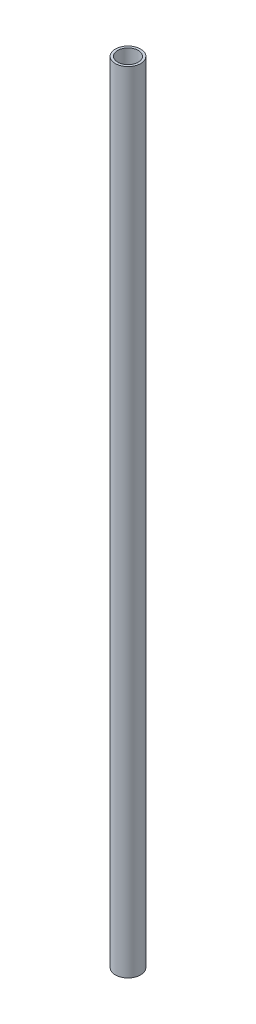
ISO-10303-21;
HEADER;
FILE_DESCRIPTION(('STEP AP214'),'2;1');
FILE_NAME('part.step','',(''),(''),'','','');
FILE_SCHEMA(('AUTOMOTIVE_DESIGN { 1 0 10303 214 1 1 1 1 }'));
ENDSEC;
DATA;
#1=APPLICATION_CONTEXT('core data for automotive mechanical design processes');
#2=APPLICATION_PROTOCOL_DEFINITION('international standard','automotive_design',2000,#1);
#3=PRODUCT_CONTEXT('',#1,'mechanical');
#4=PRODUCT('Part','Part','',(#3));
#5=PRODUCT_RELATED_PRODUCT_CATEGORY('part','',(#4));
#6=PRODUCT_DEFINITION_FORMATION('','',#4);
#7=PRODUCT_DEFINITION_CONTEXT('part definition',#1,'design');
#8=PRODUCT_DEFINITION('design','',#6,#7);
#9=PRODUCT_DEFINITION_SHAPE('','',#8);
#10=(LENGTH_UNIT() NAMED_UNIT(*) SI_UNIT(.MILLI.,.METRE.));
#11=(NAMED_UNIT(*) PLANE_ANGLE_UNIT() SI_UNIT($,.RADIAN.));
#12=(NAMED_UNIT(*) SI_UNIT($,.STERADIAN.) SOLID_ANGLE_UNIT());
#13=UNCERTAINTY_MEASURE_WITH_UNIT(LENGTH_MEASURE(1.E-05),#10,'distance_accuracy_value','');
#14=(GEOMETRIC_REPRESENTATION_CONTEXT(3) GLOBAL_UNCERTAINTY_ASSIGNED_CONTEXT((#13)) GLOBAL_UNIT_ASSIGNED_CONTEXT((#10,
#11,#12)) REPRESENTATION_CONTEXT('',''));
#15=CARTESIAN_POINT('',(0.,0.,0.));
#16=DIRECTION('',(0.,0.,1.));
#17=DIRECTION('',(1.,0.,0.));
#18=AXIS2_PLACEMENT_3D('',#15,#16,#17);
#19=CARTESIAN_POINT('',(0.,500.,0.));
#20=DIRECTION('',(0.,1.,0.));
#21=DIRECTION('',(0.,0.,1.));
#22=AXIS2_PLACEMENT_3D('',#19,#20,#21);
#23=PLANE('',#22);
#24=CARTESIAN_POINT('',(0.,500.,0.));
#25=DIRECTION('',(0.,1.,0.));
#26=DIRECTION('',(0.,0.,1.));
#27=AXIS2_PLACEMENT_3D('',#24,#25,#26);
#28=CIRCLE('',#27,8.);
#29=CARTESIAN_POINT('',(0.,500.,8.));
#30=VERTEX_POINT('',#29);
#31=EDGE_CURVE('E10',#30,#30,#28,.T.);
#32=ORIENTED_EDGE('',*,*,#31,.T.);
#33=EDGE_LOOP('',(#32));
#34=FACE_BOUND('',#33,.T.);
#35=CARTESIAN_POINT('',(0.,500.,0.));
#36=DIRECTION('',(0.,1.,0.));
#37=DIRECTION('',(0.,0.,1.));
#38=AXIS2_PLACEMENT_3D('',#35,#36,#37);
#39=CIRCLE('',#38,6.5);
#40=CARTESIAN_POINT('',(0.,500.,6.5));
#41=VERTEX_POINT('',#40);
#42=EDGE_CURVE('E46',#41,#41,#39,.T.);
#43=ORIENTED_EDGE('',*,*,#42,.F.);
#44=EDGE_LOOP('',(#43));
#45=FACE_BOUND('',#44,.T.);
#46=ADVANCED_FACE('F35',(#34,#45),#23,.T.);
#47=CARTESIAN_POINT('',(0.,0.,0.));
#48=DIRECTION('',(0.,1.,0.));
#49=DIRECTION('',(0.,0.,1.));
#50=AXIS2_PLACEMENT_3D('',#47,#48,#49);
#51=PLANE('',#50);
#52=CARTESIAN_POINT('',(0.,0.,0.));
#53=DIRECTION('',(0.,1.,0.));
#54=DIRECTION('',(0.,0.,1.));
#55=AXIS2_PLACEMENT_3D('',#52,#53,#54);
#56=CIRCLE('',#55,8.);
#57=CARTESIAN_POINT('',(0.,0.,8.));
#58=VERTEX_POINT('',#57);
#59=EDGE_CURVE('E39',#58,#58,#56,.T.);
#60=ORIENTED_EDGE('',*,*,#59,.F.);
#61=EDGE_LOOP('',(#60));
#62=FACE_BOUND('',#61,.T.);
#63=CARTESIAN_POINT('',(0.,0.,0.));
#64=DIRECTION('',(0.,1.,0.));
#65=DIRECTION('',(0.,0.,1.));
#66=AXIS2_PLACEMENT_3D('',#63,#64,#65);
#67=CIRCLE('',#66,6.5);
#68=CARTESIAN_POINT('',(0.,0.,6.5));
#69=VERTEX_POINT('',#68);
#70=EDGE_CURVE('E48',#69,#69,#67,.T.);
#71=ORIENTED_EDGE('',*,*,#70,.T.);
#72=EDGE_LOOP('',(#71));
#73=FACE_BOUND('',#72,.T.);
#74=ADVANCED_FACE('F58',(#62,#73),#51,.F.);
#75=CARTESIAN_POINT('',(0.,500.,0.));
#76=DIRECTION('',(0.,-1.,0.));
#77=DIRECTION('',(0.,0.,-1.));
#78=AXIS2_PLACEMENT_3D('',#75,#76,#77);
#79=CYLINDRICAL_SURFACE('',#78,8.);
#80=ORIENTED_EDGE('',*,*,#31,.F.);
#81=EDGE_LOOP('',(#80));
#82=FACE_BOUND('',#81,.T.);
#83=ORIENTED_EDGE('',*,*,#59,.T.);
#84=EDGE_LOOP('',(#83));
#85=FACE_BOUND('',#84,.T.);
#86=ADVANCED_FACE('F37',(#82,#85),#79,.T.);
#87=CARTESIAN_POINT('',(0.,500.,0.));
#88=DIRECTION('',(0.,-1.,0.));
#89=DIRECTION('',(0.,0.,-1.));
#90=AXIS2_PLACEMENT_3D('',#87,#88,#89);
#91=CYLINDRICAL_SURFACE('',#90,6.5);
#92=ORIENTED_EDGE('',*,*,#42,.T.);
#93=EDGE_LOOP('',(#92));
#94=FACE_BOUND('',#93,.T.);
#95=ORIENTED_EDGE('',*,*,#70,.F.);
#96=EDGE_LOOP('',(#95));
#97=FACE_BOUND('',#96,.T.);
#98=ADVANCED_FACE('F54',(#94,#97),#91,.F.);
#99=CLOSED_SHELL('',(#46,#74,#86,#98));
#100=MANIFOLD_SOLID_BREP('B2',#99);
#101=ADVANCED_BREP_SHAPE_REPRESENTATION('',(#18,#100),#14);
#102=SHAPE_DEFINITION_REPRESENTATION(#9,#101);
ENDSEC;
END-ISO-10303-21;
